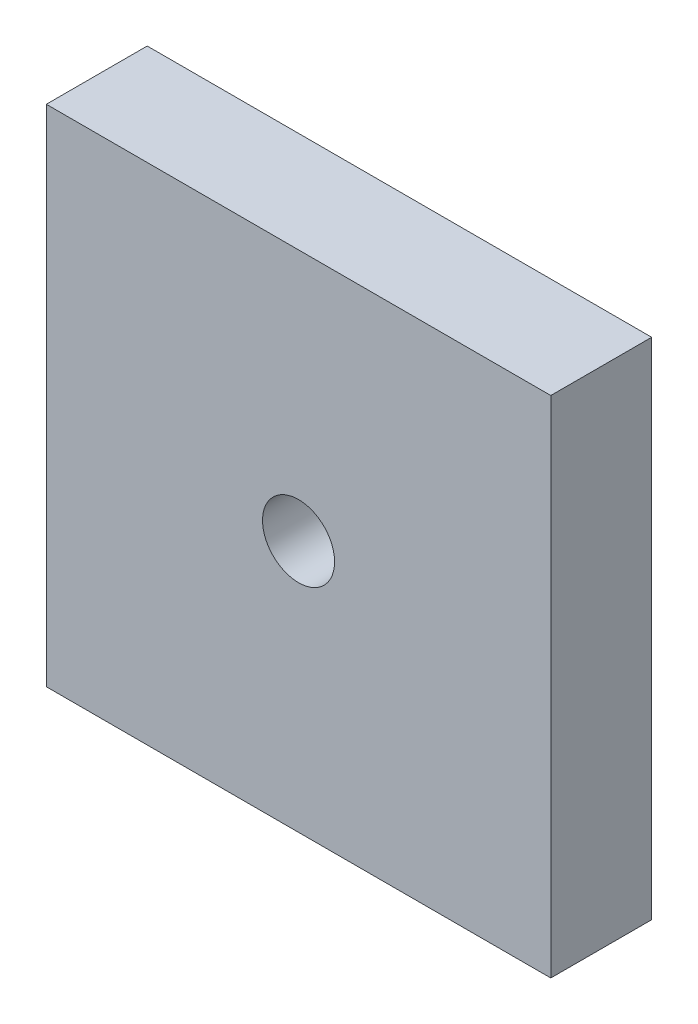
ISO-10303-21;
HEADER;
FILE_DESCRIPTION(('STEP AP214'),'2;1');
FILE_NAME('part.step','',(''),(''),'','','');
FILE_SCHEMA(('AUTOMOTIVE_DESIGN { 1 0 10303 214 1 1 1 1 }'));
ENDSEC;
DATA;
#1=APPLICATION_CONTEXT('core data for automotive mechanical design processes');
#2=APPLICATION_PROTOCOL_DEFINITION('international standard','automotive_design',2000,#1);
#3=PRODUCT_CONTEXT('',#1,'mechanical');
#4=PRODUCT('Part','Part','',(#3));
#5=PRODUCT_RELATED_PRODUCT_CATEGORY('part','',(#4));
#6=PRODUCT_DEFINITION_FORMATION('','',#4);
#7=PRODUCT_DEFINITION_CONTEXT('part definition',#1,'design');
#8=PRODUCT_DEFINITION('design','',#6,#7);
#9=PRODUCT_DEFINITION_SHAPE('','',#8);
#10=(LENGTH_UNIT() NAMED_UNIT(*) SI_UNIT(.MILLI.,.METRE.));
#11=(NAMED_UNIT(*) PLANE_ANGLE_UNIT() SI_UNIT($,.RADIAN.));
#12=(NAMED_UNIT(*) SI_UNIT($,.STERADIAN.) SOLID_ANGLE_UNIT());
#13=UNCERTAINTY_MEASURE_WITH_UNIT(LENGTH_MEASURE(1.E-05),#10,'distance_accuracy_value','');
#14=(GEOMETRIC_REPRESENTATION_CONTEXT(3) GLOBAL_UNCERTAINTY_ASSIGNED_CONTEXT((#13)) GLOBAL_UNIT_ASSIGNED_CONTEXT((#10,
#11,#12)) REPRESENTATION_CONTEXT('',''));
#15=CARTESIAN_POINT('',(0.,0.,0.));
#16=DIRECTION('',(0.,0.,1.));
#17=DIRECTION('',(1.,0.,0.));
#18=AXIS2_PLACEMENT_3D('',#15,#16,#17);
#19=CARTESIAN_POINT('',(-7.,-7.,2.8));
#20=DIRECTION('',(0.,1.,0.));
#21=DIRECTION('',(0.,0.,1.));
#22=AXIS2_PLACEMENT_3D('',#19,#20,#21);
#23=PLANE('',#22);
#24=DIRECTION('',(1.,0.,0.));
#25=VECTOR('',#24,1.);
#26=CARTESIAN_POINT('',(-7.,-7.,0.));
#27=LINE('',#26,#25);
#28=CARTESIAN_POINT('',(-7.,-7.,0.));
#29=VERTEX_POINT('',#28);
#30=CARTESIAN_POINT('',(7.,-7.,0.));
#31=VERTEX_POINT('',#30);
#32=EDGE_CURVE('E106',#29,#31,#27,.T.);
#33=ORIENTED_EDGE('',*,*,#32,.T.);
#34=DIRECTION('',(0.,0.,-1.));
#35=VECTOR('',#34,1.);
#36=CARTESIAN_POINT('',(7.,-7.,2.8));
#37=LINE('',#36,#35);
#38=CARTESIAN_POINT('',(7.,-7.,2.8));
#39=VERTEX_POINT('',#38);
#40=EDGE_CURVE('E11',#39,#31,#37,.T.);
#41=ORIENTED_EDGE('',*,*,#40,.F.);
#42=DIRECTION('',(1.,0.,0.));
#43=VECTOR('',#42,1.);
#44=CARTESIAN_POINT('',(-7.,-7.,2.8));
#45=LINE('',#44,#43);
#46=CARTESIAN_POINT('',(-7.,-7.,2.8));
#47=VERTEX_POINT('',#46);
#48=EDGE_CURVE('E79',#47,#39,#45,.T.);
#49=ORIENTED_EDGE('',*,*,#48,.F.);
#50=DIRECTION('',(0.,0.,-1.));
#51=VECTOR('',#50,1.);
#52=CARTESIAN_POINT('',(-7.,-7.,2.8));
#53=LINE('',#52,#51);
#54=EDGE_CURVE('E102',#47,#29,#53,.T.);
#55=ORIENTED_EDGE('',*,*,#54,.T.);
#56=EDGE_LOOP('',(#33,#41,#49,#55));
#57=FACE_BOUND('',#56,.T.);
#58=ADVANCED_FACE('F39',(#57),#23,.F.);
#59=CARTESIAN_POINT('',(7.,7.,2.8));
#60=DIRECTION('',(1.,0.,0.));
#61=DIRECTION('',(0.,1.,0.));
#62=AXIS2_PLACEMENT_3D('',#59,#60,#61);
#63=PLANE('',#62);
#64=DIRECTION('',(0.,-1.,0.));
#65=VECTOR('',#64,1.);
#66=CARTESIAN_POINT('',(7.,7.,0.));
#67=LINE('',#66,#65);
#68=CARTESIAN_POINT('',(7.,7.,0.));
#69=VERTEX_POINT('',#68);
#70=EDGE_CURVE('E88',#69,#31,#67,.T.);
#71=ORIENTED_EDGE('',*,*,#70,.F.);
#72=DIRECTION('',(0.,0.,-1.));
#73=VECTOR('',#72,1.);
#74=CARTESIAN_POINT('',(7.,7.,2.8));
#75=LINE('',#74,#73);
#76=CARTESIAN_POINT('',(7.,7.,2.8));
#77=VERTEX_POINT('',#76);
#78=EDGE_CURVE('E48',#77,#69,#75,.T.);
#79=ORIENTED_EDGE('',*,*,#78,.F.);
#80=DIRECTION('',(0.,-1.,0.));
#81=VECTOR('',#80,1.);
#82=CARTESIAN_POINT('',(7.,7.,2.8));
#83=LINE('',#82,#81);
#84=EDGE_CURVE('E86',#77,#39,#83,.T.);
#85=ORIENTED_EDGE('',*,*,#84,.T.);
#86=ORIENTED_EDGE('',*,*,#40,.T.);
#87=EDGE_LOOP('',(#71,#79,#85,#86));
#88=FACE_BOUND('',#87,.T.);
#89=ADVANCED_FACE('F85',(#88),#63,.T.);
#90=CARTESIAN_POINT('',(-7.,7.,2.8));
#91=DIRECTION('',(0.,1.,0.));
#92=DIRECTION('',(0.,0.,1.));
#93=AXIS2_PLACEMENT_3D('',#90,#91,#92);
#94=PLANE('',#93);
#95=DIRECTION('',(1.,0.,0.));
#96=VECTOR('',#95,1.);
#97=CARTESIAN_POINT('',(-7.,7.,0.));
#98=LINE('',#97,#96);
#99=CARTESIAN_POINT('',(-7.,7.,0.));
#100=VERTEX_POINT('',#99);
#101=EDGE_CURVE('E113',#100,#69,#98,.T.);
#102=ORIENTED_EDGE('',*,*,#101,.F.);
#103=DIRECTION('',(0.,0.,-1.));
#104=VECTOR('',#103,1.);
#105=CARTESIAN_POINT('',(-7.,7.,2.8));
#106=LINE('',#105,#104);
#107=CARTESIAN_POINT('',(-7.,7.,2.8));
#108=VERTEX_POINT('',#107);
#109=EDGE_CURVE('E71',#108,#100,#106,.T.);
#110=ORIENTED_EDGE('',*,*,#109,.F.);
#111=DIRECTION('',(1.,0.,0.));
#112=VECTOR('',#111,1.);
#113=CARTESIAN_POINT('',(-7.,7.,2.8));
#114=LINE('',#113,#112);
#115=EDGE_CURVE('E95',#108,#77,#114,.T.);
#116=ORIENTED_EDGE('',*,*,#115,.T.);
#117=ORIENTED_EDGE('',*,*,#78,.T.);
#118=EDGE_LOOP('',(#102,#110,#116,#117));
#119=FACE_BOUND('',#118,.T.);
#120=ADVANCED_FACE('F98',(#119),#94,.T.);
#121=CARTESIAN_POINT('',(-7.,7.,2.8));
#122=DIRECTION('',(1.,0.,0.));
#123=DIRECTION('',(0.,1.,0.));
#124=AXIS2_PLACEMENT_3D('',#121,#122,#123);
#125=PLANE('',#124);
#126=DIRECTION('',(0.,-1.,0.));
#127=VECTOR('',#126,1.);
#128=CARTESIAN_POINT('',(-7.,7.,0.));
#129=LINE('',#128,#127);
#130=EDGE_CURVE('E74',#100,#29,#129,.T.);
#131=ORIENTED_EDGE('',*,*,#130,.T.);
#132=ORIENTED_EDGE('',*,*,#54,.F.);
#133=DIRECTION('',(0.,-1.,0.));
#134=VECTOR('',#133,1.);
#135=CARTESIAN_POINT('',(-7.,7.,2.8));
#136=LINE('',#135,#134);
#137=EDGE_CURVE('E56',#108,#47,#136,.T.);
#138=ORIENTED_EDGE('',*,*,#137,.F.);
#139=ORIENTED_EDGE('',*,*,#109,.T.);
#140=EDGE_LOOP('',(#131,#132,#138,#139));
#141=FACE_BOUND('',#140,.T.);
#142=ADVANCED_FACE('F135',(#141),#125,.F.);
#143=CARTESIAN_POINT('',(0.,0.,2.8));
#144=DIRECTION('',(0.,0.,-1.));
#145=DIRECTION('',(-1.,0.,0.));
#146=AXIS2_PLACEMENT_3D('',#143,#144,#145);
#147=PLANE('',#146);
#148=CARTESIAN_POINT('',(0.,0.,2.8));
#149=DIRECTION('',(0.,0.,1.));
#150=DIRECTION('',(1.,0.,0.));
#151=AXIS2_PLACEMENT_3D('',#148,#149,#150);
#152=CIRCLE('',#151,1.);
#153=CARTESIAN_POINT('',(1.,0.,2.8));
#154=VERTEX_POINT('',#153);
#155=EDGE_CURVE('E110',#154,#154,#152,.T.);
#156=ORIENTED_EDGE('',*,*,#155,.F.);
#157=EDGE_LOOP('',(#156));
#158=FACE_BOUND('',#157,.T.);
#159=ORIENTED_EDGE('',*,*,#48,.T.);
#160=ORIENTED_EDGE('',*,*,#84,.F.);
#161=ORIENTED_EDGE('',*,*,#115,.F.);
#162=ORIENTED_EDGE('',*,*,#137,.T.);
#163=EDGE_LOOP('',(#159,#160,#161,#162));
#164=FACE_BOUND('',#163,.T.);
#165=ADVANCED_FACE('F94',(#158,#164),#147,.F.);
#166=CARTESIAN_POINT('',(0.,0.,0.));
#167=DIRECTION('',(0.,0.,-1.));
#168=DIRECTION('',(-1.,0.,0.));
#169=AXIS2_PLACEMENT_3D('',#166,#167,#168);
#170=PLANE('',#169);
#171=CARTESIAN_POINT('',(0.,0.,0.));
#172=DIRECTION('',(0.,0.,1.));
#173=DIRECTION('',(1.,0.,0.));
#174=AXIS2_PLACEMENT_3D('',#171,#172,#173);
#175=CIRCLE('',#174,1.);
#176=CARTESIAN_POINT('',(1.,0.,0.));
#177=VERTEX_POINT('',#176);
#178=EDGE_CURVE('E186',#177,#177,#175,.T.);
#179=ORIENTED_EDGE('',*,*,#178,.T.);
#180=EDGE_LOOP('',(#179));
#181=FACE_BOUND('',#180,.T.);
#182=ORIENTED_EDGE('',*,*,#32,.F.);
#183=ORIENTED_EDGE('',*,*,#130,.F.);
#184=ORIENTED_EDGE('',*,*,#101,.T.);
#185=ORIENTED_EDGE('',*,*,#70,.T.);
#186=EDGE_LOOP('',(#182,#183,#184,#185));
#187=FACE_BOUND('',#186,.T.);
#188=ADVANCED_FACE('F124',(#181,#187),#170,.T.);
#189=CARTESIAN_POINT('',(0.,0.,2.8));
#190=DIRECTION('',(0.,0.,-1.));
#191=DIRECTION('',(-1.,0.,0.));
#192=AXIS2_PLACEMENT_3D('',#189,#190,#191);
#193=CYLINDRICAL_SURFACE('',#192,1.);
#194=ORIENTED_EDGE('',*,*,#155,.T.);
#195=EDGE_LOOP('',(#194));
#196=FACE_BOUND('',#195,.T.);
#197=ORIENTED_EDGE('',*,*,#178,.F.);
#198=EDGE_LOOP('',(#197));
#199=FACE_BOUND('',#198,.T.);
#200=ADVANCED_FACE('F126',(#196,#199),#193,.F.);
#201=CLOSED_SHELL('',(#58,#89,#120,#142,#165,#188,#200));
#202=MANIFOLD_SOLID_BREP('B2',#201);
#203=ADVANCED_BREP_SHAPE_REPRESENTATION('',(#18,#202),#14);
#204=SHAPE_DEFINITION_REPRESENTATION(#9,#203);
ENDSEC;
END-ISO-10303-21;
